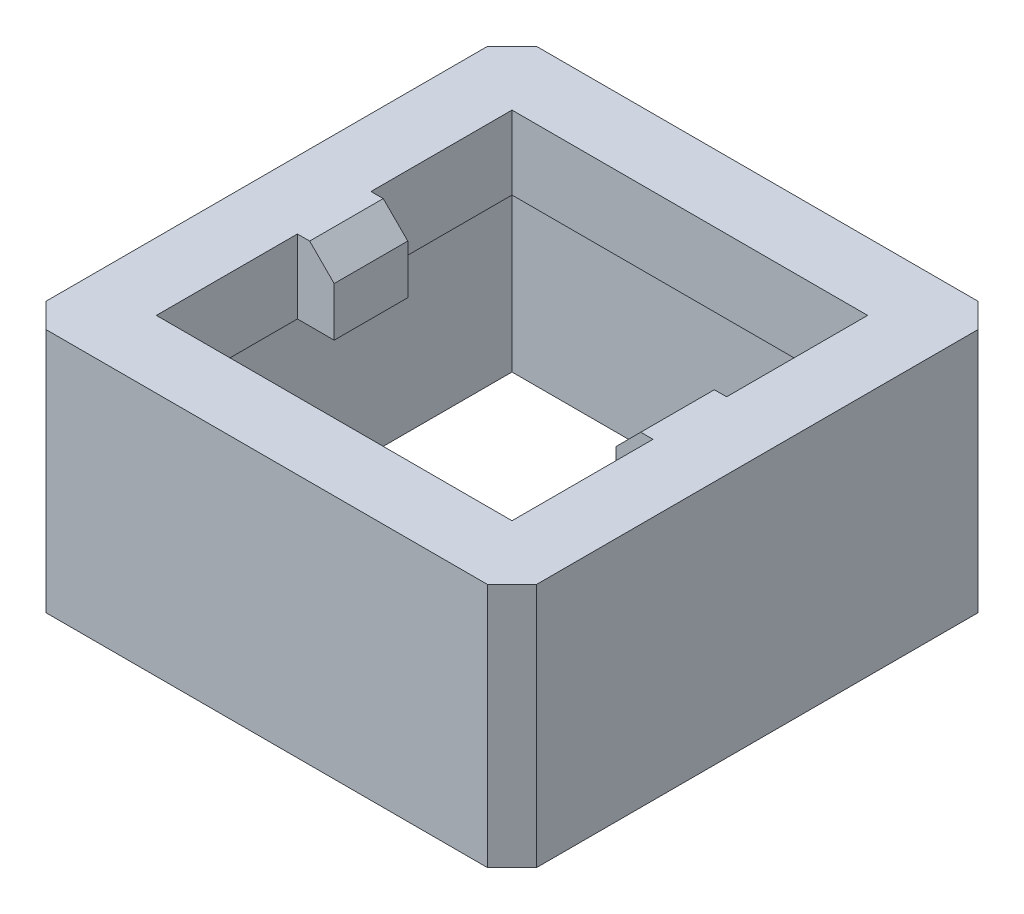
ISO-10303-21;
HEADER;
FILE_DESCRIPTION(('STEP AP214'),'2;1');
FILE_NAME('part.step','',(''),(''),'','','');
FILE_SCHEMA(('AUTOMOTIVE_DESIGN { 1 0 10303 214 1 1 1 1 }'));
ENDSEC;
DATA;
#1=APPLICATION_CONTEXT('core data for automotive mechanical design processes');
#2=APPLICATION_PROTOCOL_DEFINITION('international standard','automotive_design',2000,#1);
#3=PRODUCT_CONTEXT('',#1,'mechanical');
#4=PRODUCT('Part','Part','',(#3));
#5=PRODUCT_RELATED_PRODUCT_CATEGORY('part','',(#4));
#6=PRODUCT_DEFINITION_FORMATION('','',#4);
#7=PRODUCT_DEFINITION_CONTEXT('part definition',#1,'design');
#8=PRODUCT_DEFINITION('design','',#6,#7);
#9=PRODUCT_DEFINITION_SHAPE('','',#8);
#10=(LENGTH_UNIT() NAMED_UNIT(*) SI_UNIT(.MILLI.,.METRE.));
#11=(NAMED_UNIT(*) PLANE_ANGLE_UNIT() SI_UNIT($,.RADIAN.));
#12=(NAMED_UNIT(*) SI_UNIT($,.STERADIAN.) SOLID_ANGLE_UNIT());
#13=UNCERTAINTY_MEASURE_WITH_UNIT(LENGTH_MEASURE(1.E-05),#10,'distance_accuracy_value','');
#14=(GEOMETRIC_REPRESENTATION_CONTEXT(3) GLOBAL_UNCERTAINTY_ASSIGNED_CONTEXT((#13)) GLOBAL_UNIT_ASSIGNED_CONTEXT((#10,
#11,#12)) REPRESENTATION_CONTEXT('',''));
#15=CARTESIAN_POINT('',(0.,0.,0.));
#16=DIRECTION('',(0.,0.,1.));
#17=DIRECTION('',(1.,0.,0.));
#18=AXIS2_PLACEMENT_3D('',#15,#16,#17);
#19=CARTESIAN_POINT('',(-7.25,0.,7.25));
#20=DIRECTION('',(-1.,0.,0.));
#21=DIRECTION('',(0.,0.,1.));
#22=AXIS2_PLACEMENT_3D('',#19,#20,#21);
#23=PLANE('',#22);
#24=DIRECTION('',(0.,0.,1.));
#25=VECTOR('',#24,1.);
#26=CARTESIAN_POINT('',(-7.25,3.,7.25));
#27=LINE('',#26,#25);
#28=CARTESIAN_POINT('',(-7.25,3.,-7.25));
#29=VERTEX_POINT('',#28);
#30=CARTESIAN_POINT('',(-7.25,3.,-1.5));
#31=VERTEX_POINT('',#30);
#32=EDGE_CURVE('E338',#29,#31,#27,.T.);
#33=ORIENTED_EDGE('',*,*,#32,.T.);
#34=DIRECTION('',(0.,1.,0.));
#35=VECTOR('',#34,1.);
#36=CARTESIAN_POINT('',(-7.25,0.,-1.5));
#37=LINE('',#36,#35);
#38=CARTESIAN_POINT('',(-7.25,0.,-1.5));
#39=VERTEX_POINT('',#38);
#40=EDGE_CURVE('E278',#39,#31,#37,.T.);
#41=ORIENTED_EDGE('',*,*,#40,.F.);
#42=DIRECTION('',(0.,0.,1.));
#43=VECTOR('',#42,1.);
#44=CARTESIAN_POINT('',(-7.25,0.,7.25));
#45=LINE('',#44,#43);
#46=CARTESIAN_POINT('',(-7.25,0.,-7.25));
#47=VERTEX_POINT('',#46);
#48=EDGE_CURVE('E324',#47,#39,#45,.T.);
#49=ORIENTED_EDGE('',*,*,#48,.F.);
#50=DIRECTION('',(0.,1.,0.));
#51=VECTOR('',#50,1.);
#52=CARTESIAN_POINT('',(-7.25,0.,-7.25));
#53=LINE('',#52,#51);
#54=EDGE_CURVE('E350',#47,#29,#53,.T.);
#55=ORIENTED_EDGE('',*,*,#54,.T.);
#56=EDGE_LOOP('',(#33,#41,#49,#55));
#57=FACE_BOUND('',#56,.T.);
#58=ADVANCED_FACE('F35',(#57),#23,.F.);
#59=CARTESIAN_POINT('',(7.25,0.,7.25));
#60=DIRECTION('',(1.,0.,0.));
#61=DIRECTION('',(0.,0.,-1.));
#62=AXIS2_PLACEMENT_3D('',#59,#60,#61);
#63=PLANE('',#62);
#64=DIRECTION('',(0.,0.,-1.));
#65=VECTOR('',#64,1.);
#66=CARTESIAN_POINT('',(7.25,3.,7.25));
#67=LINE('',#66,#65);
#68=CARTESIAN_POINT('',(7.25,3.,7.25));
#69=VERTEX_POINT('',#68);
#70=CARTESIAN_POINT('',(7.25,3.,1.5));
#71=VERTEX_POINT('',#70);
#72=EDGE_CURVE('E331',#69,#71,#67,.T.);
#73=ORIENTED_EDGE('',*,*,#72,.T.);
#74=DIRECTION('',(0.,1.,0.));
#75=VECTOR('',#74,1.);
#76=CARTESIAN_POINT('',(7.25,0.,1.5));
#77=LINE('',#76,#75);
#78=CARTESIAN_POINT('',(7.25,0.,1.5));
#79=VERTEX_POINT('',#78);
#80=EDGE_CURVE('E304',#79,#71,#77,.T.);
#81=ORIENTED_EDGE('',*,*,#80,.F.);
#82=DIRECTION('',(0.,0.,-1.));
#83=VECTOR('',#82,1.);
#84=CARTESIAN_POINT('',(7.25,0.,7.25));
#85=LINE('',#84,#83);
#86=CARTESIAN_POINT('',(7.25,0.,7.25));
#87=VERTEX_POINT('',#86);
#88=EDGE_CURVE('E316',#87,#79,#85,.T.);
#89=ORIENTED_EDGE('',*,*,#88,.F.);
#90=DIRECTION('',(0.,1.,0.));
#91=VECTOR('',#90,1.);
#92=CARTESIAN_POINT('',(7.25,0.,7.25));
#93=LINE('',#92,#91);
#94=EDGE_CURVE('E344',#87,#69,#93,.T.);
#95=ORIENTED_EDGE('',*,*,#94,.T.);
#96=EDGE_LOOP('',(#73,#81,#89,#95));
#97=FACE_BOUND('',#96,.T.);
#98=ADVANCED_FACE('F451',(#97),#63,.F.);
#99=CARTESIAN_POINT('',(10.,3.,10.));
#100=DIRECTION('',(-1.,0.,0.));
#101=DIRECTION('',(0.,0.,1.));
#102=AXIS2_PLACEMENT_3D('',#99,#100,#101);
#103=PLANE('',#102);
#104=DIRECTION('',(0.,0.,-1.));
#105=VECTOR('',#104,1.);
#106=CARTESIAN_POINT('',(10.,3.,10.));
#107=LINE('',#106,#105);
#108=CARTESIAN_POINT('',(10.,3.,9.));
#109=VERTEX_POINT('',#108);
#110=CARTESIAN_POINT('',(10.,3.,-8.99999999999999));
#111=VERTEX_POINT('',#110);
#112=EDGE_CURVE('E346',#109,#111,#107,.T.);
#113=ORIENTED_EDGE('',*,*,#112,.F.);
#114=DIRECTION('',(0.,-1.,0.));
#115=VECTOR('',#114,1.);
#116=CARTESIAN_POINT('',(10.,3.,9.));
#117=LINE('',#116,#115);
#118=CARTESIAN_POINT('',(10.,-7.,9.));
#119=VERTEX_POINT('',#118);
#120=EDGE_CURVE('E408',#109,#119,#117,.T.);
#121=ORIENTED_EDGE('',*,*,#120,.T.);
#122=DIRECTION('',(0.,0.,1.));
#123=VECTOR('',#122,1.);
#124=CARTESIAN_POINT('',(10.,-7.,10.));
#125=LINE('',#124,#123);
#126=CARTESIAN_POINT('',(10.,-7.,-8.99999999999999));
#127=VERTEX_POINT('',#126);
#128=EDGE_CURVE('E229',#127,#119,#125,.T.);
#129=ORIENTED_EDGE('',*,*,#128,.F.);
#130=DIRECTION('',(0.,1.,0.));
#131=VECTOR('',#130,1.);
#132=CARTESIAN_POINT('',(10.,3.,-8.99999999999999));
#133=LINE('',#132,#131);
#134=EDGE_CURVE('E406',#127,#111,#133,.T.);
#135=ORIENTED_EDGE('',*,*,#134,.T.);
#136=EDGE_LOOP('',(#113,#121,#129,#135));
#137=FACE_BOUND('',#136,.T.);
#138=ADVANCED_FACE('F414',(#137),#103,.F.);
#139=CARTESIAN_POINT('',(-10.,3.,-10.));
#140=DIRECTION('',(0.,0.,1.));
#141=DIRECTION('',(1.,0.,0.));
#142=AXIS2_PLACEMENT_3D('',#139,#140,#141);
#143=PLANE('',#142);
#144=DIRECTION('',(-1.,0.,0.));
#145=VECTOR('',#144,1.);
#146=CARTESIAN_POINT('',(-10.,3.,-10.));
#147=LINE('',#146,#145);
#148=CARTESIAN_POINT('',(9.,3.,-10.));
#149=VERTEX_POINT('',#148);
#150=CARTESIAN_POINT('',(-9.,3.,-10.));
#151=VERTEX_POINT('',#150);
#152=EDGE_CURVE('E355',#149,#151,#147,.T.);
#153=ORIENTED_EDGE('',*,*,#152,.F.);
#154=DIRECTION('',(0.,-1.,0.));
#155=VECTOR('',#154,1.);
#156=CARTESIAN_POINT('',(9.,3.,-10.));
#157=LINE('',#156,#155);
#158=CARTESIAN_POINT('',(9.,-7.,-10.));
#159=VERTEX_POINT('',#158);
#160=EDGE_CURVE('E11',#149,#159,#157,.T.);
#161=ORIENTED_EDGE('',*,*,#160,.T.);
#162=DIRECTION('',(1.,0.,0.));
#163=VECTOR('',#162,1.);
#164=CARTESIAN_POINT('',(10.,-7.,-10.));
#165=LINE('',#164,#163);
#166=CARTESIAN_POINT('',(-9.,-7.,-10.));
#167=VERTEX_POINT('',#166);
#168=EDGE_CURVE('E260',#167,#159,#165,.T.);
#169=ORIENTED_EDGE('',*,*,#168,.F.);
#170=DIRECTION('',(0.,1.,0.));
#171=VECTOR('',#170,1.);
#172=CARTESIAN_POINT('',(-9.,3.,-10.));
#173=LINE('',#172,#171);
#174=EDGE_CURVE('E43',#167,#151,#173,.T.);
#175=ORIENTED_EDGE('',*,*,#174,.T.);
#176=EDGE_LOOP('',(#153,#161,#169,#175));
#177=FACE_BOUND('',#176,.T.);
#178=ADVANCED_FACE('F423',(#177),#143,.F.);
#179=CARTESIAN_POINT('',(-10.,3.,10.));
#180=DIRECTION('',(1.,0.,0.));
#181=DIRECTION('',(0.,0.,-1.));
#182=AXIS2_PLACEMENT_3D('',#179,#180,#181);
#183=PLANE('',#182);
#184=DIRECTION('',(0.,0.,-1.));
#185=VECTOR('',#184,1.);
#186=CARTESIAN_POINT('',(-10.,-7.,10.));
#187=LINE('',#186,#185);
#188=CARTESIAN_POINT('',(-10.,-7.,9.));
#189=VERTEX_POINT('',#188);
#190=CARTESIAN_POINT('',(-10.,-7.,-9.));
#191=VERTEX_POINT('',#190);
#192=EDGE_CURVE('E257',#189,#191,#187,.T.);
#193=ORIENTED_EDGE('',*,*,#192,.F.);
#194=DIRECTION('',(0.,1.,0.));
#195=VECTOR('',#194,1.);
#196=CARTESIAN_POINT('',(-10.,3.,9.));
#197=LINE('',#196,#195);
#198=CARTESIAN_POINT('',(-10.,3.,9.));
#199=VERTEX_POINT('',#198);
#200=EDGE_CURVE('E397',#189,#199,#197,.T.);
#201=ORIENTED_EDGE('',*,*,#200,.T.);
#202=DIRECTION('',(0.,0.,1.));
#203=VECTOR('',#202,1.);
#204=CARTESIAN_POINT('',(-10.,3.,10.));
#205=LINE('',#204,#203);
#206=CARTESIAN_POINT('',(-10.,3.,-9.));
#207=VERTEX_POINT('',#206);
#208=EDGE_CURVE('E357',#207,#199,#205,.T.);
#209=ORIENTED_EDGE('',*,*,#208,.F.);
#210=DIRECTION('',(0.,-1.,0.));
#211=VECTOR('',#210,1.);
#212=CARTESIAN_POINT('',(-10.,3.,-9.));
#213=LINE('',#212,#211);
#214=EDGE_CURVE('E394',#207,#191,#213,.T.);
#215=ORIENTED_EDGE('',*,*,#214,.T.);
#216=EDGE_LOOP('',(#193,#201,#209,#215));
#217=FACE_BOUND('',#216,.T.);
#218=ADVANCED_FACE('F431',(#217),#183,.F.);
#219=CARTESIAN_POINT('',(-10.,3.,10.));
#220=DIRECTION('',(0.,0.,-1.));
#221=DIRECTION('',(-1.,0.,0.));
#222=AXIS2_PLACEMENT_3D('',#219,#220,#221);
#223=PLANE('',#222);
#224=DIRECTION('',(1.,0.,0.));
#225=VECTOR('',#224,1.);
#226=CARTESIAN_POINT('',(-10.,3.,10.));
#227=LINE('',#226,#225);
#228=CARTESIAN_POINT('',(-9.,3.,10.));
#229=VERTEX_POINT('',#228);
#230=CARTESIAN_POINT('',(8.99999999999999,3.,10.));
#231=VERTEX_POINT('',#230);
#232=EDGE_CURVE('E360',#229,#231,#227,.T.);
#233=ORIENTED_EDGE('',*,*,#232,.F.);
#234=DIRECTION('',(0.,-1.,0.));
#235=VECTOR('',#234,1.);
#236=CARTESIAN_POINT('',(-9.,3.,10.));
#237=LINE('',#236,#235);
#238=CARTESIAN_POINT('',(-9.,-7.,10.));
#239=VERTEX_POINT('',#238);
#240=EDGE_CURVE('E383',#229,#239,#237,.T.);
#241=ORIENTED_EDGE('',*,*,#240,.T.);
#242=DIRECTION('',(-1.,0.,0.));
#243=VECTOR('',#242,1.);
#244=CARTESIAN_POINT('',(10.,-7.,10.));
#245=LINE('',#244,#243);
#246=CARTESIAN_POINT('',(8.99999999999999,-7.,10.));
#247=VERTEX_POINT('',#246);
#248=EDGE_CURVE('E254',#247,#239,#245,.T.);
#249=ORIENTED_EDGE('',*,*,#248,.F.);
#250=DIRECTION('',(0.,1.,0.));
#251=VECTOR('',#250,1.);
#252=CARTESIAN_POINT('',(8.99999999999999,3.,10.));
#253=LINE('',#252,#251);
#254=EDGE_CURVE('E381',#247,#231,#253,.T.);
#255=ORIENTED_EDGE('',*,*,#254,.T.);
#256=EDGE_LOOP('',(#233,#241,#249,#255));
#257=FACE_BOUND('',#256,.T.);
#258=ADVANCED_FACE('F439',(#257),#223,.F.);
#259=CARTESIAN_POINT('',(0.,3.,0.));
#260=DIRECTION('',(0.,-1.,0.));
#261=DIRECTION('',(0.,0.,-1.));
#262=AXIS2_PLACEMENT_3D('',#259,#260,#261);
#263=PLANE('',#262);
#264=DIRECTION('',(1.,0.,0.));
#265=VECTOR('',#264,1.);
#266=CARTESIAN_POINT('',(-7.25,3.,1.5));
#267=LINE('',#266,#265);
#268=CARTESIAN_POINT('',(-7.25,3.,1.5));
#269=VERTEX_POINT('',#268);
#270=CARTESIAN_POINT('',(-6.75,3.,1.5));
#271=VERTEX_POINT('',#270);
#272=EDGE_CURVE('E263',#269,#271,#267,.T.);
#273=ORIENTED_EDGE('',*,*,#272,.T.);
#274=DIRECTION('',(0.,0.,-1.));
#275=VECTOR('',#274,1.);
#276=CARTESIAN_POINT('',(-6.75,3.,-1.5));
#277=LINE('',#276,#275);
#278=CARTESIAN_POINT('',(-6.75,3.,-1.5));
#279=VERTEX_POINT('',#278);
#280=EDGE_CURVE('E366',#271,#279,#277,.T.);
#281=ORIENTED_EDGE('',*,*,#280,.T.);
#282=DIRECTION('',(-1.,0.,0.));
#283=VECTOR('',#282,1.);
#284=CARTESIAN_POINT('',(-7.25,3.,-1.5));
#285=LINE('',#284,#283);
#286=EDGE_CURVE('E268',#279,#31,#285,.T.);
#287=ORIENTED_EDGE('',*,*,#286,.T.);
#288=ORIENTED_EDGE('',*,*,#32,.F.);
#289=DIRECTION('',(-1.,0.,0.));
#290=VECTOR('',#289,1.);
#291=CARTESIAN_POINT('',(-7.25,3.,-7.25));
#292=LINE('',#291,#290);
#293=CARTESIAN_POINT('',(7.25,3.,-7.25));
#294=VERTEX_POINT('',#293);
#295=EDGE_CURVE('E334',#294,#29,#292,.T.);
#296=ORIENTED_EDGE('',*,*,#295,.F.);
#297=CARTESIAN_POINT('',(7.25,3.,-1.5));
#298=VERTEX_POINT('',#297);
#299=EDGE_CURVE('E307',#298,#294,#67,.T.);
#300=ORIENTED_EDGE('',*,*,#299,.F.);
#301=DIRECTION('',(-1.,0.,0.));
#302=VECTOR('',#301,1.);
#303=CARTESIAN_POINT('',(7.25,3.,-1.5));
#304=LINE('',#303,#302);
#305=CARTESIAN_POINT('',(6.75000000000001,3.,-1.5));
#306=VERTEX_POINT('',#305);
#307=EDGE_CURVE('E281',#298,#306,#304,.T.);
#308=ORIENTED_EDGE('',*,*,#307,.T.);
#309=DIRECTION('',(0.,0.,1.));
#310=VECTOR('',#309,1.);
#311=CARTESIAN_POINT('',(6.75000000000001,3.,1.5));
#312=LINE('',#311,#310);
#313=CARTESIAN_POINT('',(6.75000000000001,3.,1.5));
#314=VERTEX_POINT('',#313);
#315=EDGE_CURVE('E363',#306,#314,#312,.T.);
#316=ORIENTED_EDGE('',*,*,#315,.T.);
#317=DIRECTION('',(1.,0.,0.));
#318=VECTOR('',#317,1.);
#319=CARTESIAN_POINT('',(7.25,3.,1.5));
#320=LINE('',#319,#318);
#321=EDGE_CURVE('E294',#314,#71,#320,.T.);
#322=ORIENTED_EDGE('',*,*,#321,.T.);
#323=ORIENTED_EDGE('',*,*,#72,.F.);
#324=DIRECTION('',(1.,0.,0.));
#325=VECTOR('',#324,1.);
#326=CARTESIAN_POINT('',(-7.25,3.,7.25));
#327=LINE('',#326,#325);
#328=CARTESIAN_POINT('',(-7.25,3.,7.25));
#329=VERTEX_POINT('',#328);
#330=EDGE_CURVE('E341',#329,#69,#327,.T.);
#331=ORIENTED_EDGE('',*,*,#330,.F.);
#332=EDGE_CURVE('E337',#269,#329,#27,.T.);
#333=ORIENTED_EDGE('',*,*,#332,.F.);
#334=EDGE_LOOP('',(#273,#281,#287,#288,#296,#300,#308,#316,#322,#323,#331,#333));
#335=FACE_BOUND('',#334,.T.);
#336=ORIENTED_EDGE('',*,*,#208,.T.);
#337=DIRECTION('',(-0.707106781186546,0.,-0.707106781186549));
#338=VECTOR('',#337,1.);
#339=CARTESIAN_POINT('',(-9.,3.,10.));
#340=LINE('',#339,#338);
#341=EDGE_CURVE('E404',#199,#229,#340,.F.);
#342=ORIENTED_EDGE('',*,*,#341,.T.);
#343=ORIENTED_EDGE('',*,*,#232,.T.);
#344=DIRECTION('',(-0.707106781186549,0.,0.707106781186546));
#345=VECTOR('',#344,1.);
#346=CARTESIAN_POINT('',(10.,3.,9.));
#347=LINE('',#346,#345);
#348=EDGE_CURVE('E402',#231,#109,#347,.F.);
#349=ORIENTED_EDGE('',*,*,#348,.T.);
#350=ORIENTED_EDGE('',*,*,#112,.T.);
#351=DIRECTION('',(0.707106781186546,0.,0.707106781186549));
#352=VECTOR('',#351,1.);
#353=CARTESIAN_POINT('',(9.,3.,-10.));
#354=LINE('',#353,#352);
#355=EDGE_CURVE('E56',#111,#149,#354,.F.);
#356=ORIENTED_EDGE('',*,*,#355,.T.);
#357=ORIENTED_EDGE('',*,*,#152,.T.);
#358=DIRECTION('',(0.707106781186549,0.,-0.707106781186546));
#359=VECTOR('',#358,1.);
#360=CARTESIAN_POINT('',(-10.,3.,-9.));
#361=LINE('',#360,#359);
#362=EDGE_CURVE('E399',#151,#207,#361,.F.);
#363=ORIENTED_EDGE('',*,*,#362,.T.);
#364=EDGE_LOOP('',(#336,#342,#343,#349,#350,#356,#357,#363));
#365=FACE_BOUND('',#364,.T.);
#366=ADVANCED_FACE('F425',(#335,#365),#263,.F.);
#367=CARTESIAN_POINT('',(0.,0.,0.));
#368=DIRECTION('',(0.,-1.,0.));
#369=DIRECTION('',(0.,0.,-1.));
#370=AXIS2_PLACEMENT_3D('',#367,#368,#369);
#371=PLANE('',#370);
#372=DIRECTION('',(0.,0.,1.));
#373=VECTOR('',#372,1.);
#374=CARTESIAN_POINT('',(8.,0.,8.));
#375=LINE('',#374,#373);
#376=CARTESIAN_POINT('',(8.,0.,-8.));
#377=VERTEX_POINT('',#376);
#378=CARTESIAN_POINT('',(8.,0.,8.));
#379=VERTEX_POINT('',#378);
#380=EDGE_CURVE('E241',#377,#379,#375,.T.);
#381=ORIENTED_EDGE('',*,*,#380,.T.);
#382=DIRECTION('',(-1.,0.,0.));
#383=VECTOR('',#382,1.);
#384=CARTESIAN_POINT('',(8.,0.,8.));
#385=LINE('',#384,#383);
#386=CARTESIAN_POINT('',(-8.00000000000001,0.,8.));
#387=VERTEX_POINT('',#386);
#388=EDGE_CURVE('E228',#379,#387,#385,.T.);
#389=ORIENTED_EDGE('',*,*,#388,.T.);
#390=DIRECTION('',(0.,0.,-1.));
#391=VECTOR('',#390,1.);
#392=CARTESIAN_POINT('',(-8.,0.,8.));
#393=LINE('',#392,#391);
#394=CARTESIAN_POINT('',(-8.,0.,-8.));
#395=VERTEX_POINT('',#394);
#396=EDGE_CURVE('E244',#387,#395,#393,.T.);
#397=ORIENTED_EDGE('',*,*,#396,.T.);
#398=DIRECTION('',(1.,0.,0.));
#399=VECTOR('',#398,1.);
#400=CARTESIAN_POINT('',(8.,0.,-8.));
#401=LINE('',#400,#399);
#402=EDGE_CURVE('E221',#395,#377,#401,.T.);
#403=ORIENTED_EDGE('',*,*,#402,.T.);
#404=EDGE_LOOP('',(#381,#389,#397,#403));
#405=FACE_BOUND('',#404,.T.);
#406=ORIENTED_EDGE('',*,*,#88,.T.);
#407=DIRECTION('',(1.,0.,0.));
#408=VECTOR('',#407,1.);
#409=CARTESIAN_POINT('',(7.25,0.,1.5));
#410=LINE('',#409,#408);
#411=CARTESIAN_POINT('',(5.75,0.,1.5));
#412=VERTEX_POINT('',#411);
#413=EDGE_CURVE('E297',#412,#79,#410,.T.);
#414=ORIENTED_EDGE('',*,*,#413,.F.);
#415=DIRECTION('',(0.,0.,1.));
#416=VECTOR('',#415,1.);
#417=CARTESIAN_POINT('',(5.75,0.,-1.5));
#418=LINE('',#417,#416);
#419=CARTESIAN_POINT('',(5.75,0.,-1.5));
#420=VERTEX_POINT('',#419);
#421=EDGE_CURVE('E293',#420,#412,#418,.T.);
#422=ORIENTED_EDGE('',*,*,#421,.F.);
#423=DIRECTION('',(-1.,0.,0.));
#424=VECTOR('',#423,1.);
#425=CARTESIAN_POINT('',(7.25,0.,-1.5));
#426=LINE('',#425,#424);
#427=CARTESIAN_POINT('',(7.25,0.,-1.5));
#428=VERTEX_POINT('',#427);
#429=EDGE_CURVE('E290',#428,#420,#426,.T.);
#430=ORIENTED_EDGE('',*,*,#429,.F.);
#431=CARTESIAN_POINT('',(7.25,0.,-7.25));
#432=VERTEX_POINT('',#431);
#433=EDGE_CURVE('E320',#428,#432,#85,.T.);
#434=ORIENTED_EDGE('',*,*,#433,.T.);
#435=DIRECTION('',(-1.,0.,0.));
#436=VECTOR('',#435,1.);
#437=CARTESIAN_POINT('',(-7.25,0.,-7.25));
#438=LINE('',#437,#436);
#439=EDGE_CURVE('E319',#432,#47,#438,.T.);
#440=ORIENTED_EDGE('',*,*,#439,.T.);
#441=ORIENTED_EDGE('',*,*,#48,.T.);
#442=DIRECTION('',(-1.,0.,0.));
#443=VECTOR('',#442,1.);
#444=CARTESIAN_POINT('',(-7.25,0.,-1.5));
#445=LINE('',#444,#443);
#446=CARTESIAN_POINT('',(-5.75,0.,-1.5));
#447=VERTEX_POINT('',#446);
#448=EDGE_CURVE('E271',#447,#39,#445,.T.);
#449=ORIENTED_EDGE('',*,*,#448,.F.);
#450=DIRECTION('',(0.,0.,-1.));
#451=VECTOR('',#450,1.);
#452=CARTESIAN_POINT('',(-5.75,0.,-1.5));
#453=LINE('',#452,#451);
#454=CARTESIAN_POINT('',(-5.75,0.,1.5));
#455=VERTEX_POINT('',#454);
#456=EDGE_CURVE('E267',#455,#447,#453,.T.);
#457=ORIENTED_EDGE('',*,*,#456,.F.);
#458=DIRECTION('',(1.,0.,0.));
#459=VECTOR('',#458,1.);
#460=CARTESIAN_POINT('',(-7.25,0.,1.5));
#461=LINE('',#460,#459);
#462=CARTESIAN_POINT('',(-7.25,0.,1.5));
#463=VERTEX_POINT('',#462);
#464=EDGE_CURVE('E264',#463,#455,#461,.T.);
#465=ORIENTED_EDGE('',*,*,#464,.F.);
#466=CARTESIAN_POINT('',(-7.25,0.,7.25));
#467=VERTEX_POINT('',#466);
#468=EDGE_CURVE('E323',#463,#467,#45,.T.);
#469=ORIENTED_EDGE('',*,*,#468,.T.);
#470=DIRECTION('',(1.,0.,0.));
#471=VECTOR('',#470,1.);
#472=CARTESIAN_POINT('',(-7.25,0.,7.25));
#473=LINE('',#472,#471);
#474=EDGE_CURVE('E327',#467,#87,#473,.T.);
#475=ORIENTED_EDGE('',*,*,#474,.T.);
#476=EDGE_LOOP('',(#406,#414,#422,#430,#434,#440,#441,#449,#457,#465,#469,#475));
#477=FACE_BOUND('',#476,.T.);
#478=ADVANCED_FACE('F483',(#405,#477),#371,.T.);
#479=ORIENTED_EDGE('',*,*,#433,.F.);
#480=DIRECTION('',(0.,1.,0.));
#481=VECTOR('',#480,1.);
#482=CARTESIAN_POINT('',(7.25,0.,-1.5));
#483=LINE('',#482,#481);
#484=EDGE_CURVE('E300',#428,#298,#483,.T.);
#485=ORIENTED_EDGE('',*,*,#484,.T.);
#486=ORIENTED_EDGE('',*,*,#299,.T.);
#487=DIRECTION('',(0.,1.,0.));
#488=VECTOR('',#487,1.);
#489=CARTESIAN_POINT('',(7.25,0.,-7.25));
#490=LINE('',#489,#488);
#491=EDGE_CURVE('E330',#432,#294,#490,.T.);
#492=ORIENTED_EDGE('',*,*,#491,.F.);
#493=EDGE_LOOP('',(#479,#485,#486,#492));
#494=FACE_BOUND('',#493,.T.);
#495=ADVANCED_FACE('F460',(#494),#63,.F.);
#496=CARTESIAN_POINT('',(-7.25,0.,7.25));
#497=DIRECTION('',(0.,0.,1.));
#498=DIRECTION('',(1.,0.,0.));
#499=AXIS2_PLACEMENT_3D('',#496,#497,#498);
#500=PLANE('',#499);
#501=ORIENTED_EDGE('',*,*,#330,.T.);
#502=ORIENTED_EDGE('',*,*,#94,.F.);
#503=ORIENTED_EDGE('',*,*,#474,.F.);
#504=DIRECTION('',(0.,1.,0.));
#505=VECTOR('',#504,1.);
#506=CARTESIAN_POINT('',(-7.25,0.,7.25));
#507=LINE('',#506,#505);
#508=EDGE_CURVE('E347',#467,#329,#507,.T.);
#509=ORIENTED_EDGE('',*,*,#508,.T.);
#510=EDGE_LOOP('',(#501,#502,#503,#509));
#511=FACE_BOUND('',#510,.T.);
#512=ADVANCED_FACE('F465',(#511),#500,.F.);
#513=ORIENTED_EDGE('',*,*,#468,.F.);
#514=DIRECTION('',(0.,1.,0.));
#515=VECTOR('',#514,1.);
#516=CARTESIAN_POINT('',(-7.25,0.,1.5));
#517=LINE('',#516,#515);
#518=EDGE_CURVE('E274',#463,#269,#517,.T.);
#519=ORIENTED_EDGE('',*,*,#518,.T.);
#520=ORIENTED_EDGE('',*,*,#332,.T.);
#521=ORIENTED_EDGE('',*,*,#508,.F.);
#522=EDGE_LOOP('',(#513,#519,#520,#521));
#523=FACE_BOUND('',#522,.T.);
#524=ADVANCED_FACE('F454',(#523),#23,.F.);
#525=CARTESIAN_POINT('',(-7.25,0.,-7.25));
#526=DIRECTION('',(0.,0.,-1.));
#527=DIRECTION('',(-1.,0.,0.));
#528=AXIS2_PLACEMENT_3D('',#525,#526,#527);
#529=PLANE('',#528);
#530=ORIENTED_EDGE('',*,*,#295,.T.);
#531=ORIENTED_EDGE('',*,*,#54,.F.);
#532=ORIENTED_EDGE('',*,*,#439,.F.);
#533=ORIENTED_EDGE('',*,*,#491,.T.);
#534=EDGE_LOOP('',(#530,#531,#532,#533));
#535=FACE_BOUND('',#534,.T.);
#536=ADVANCED_FACE('F464',(#535),#529,.F.);
#537=CARTESIAN_POINT('',(7.25,0.,1.5));
#538=DIRECTION('',(0.,0.,1.));
#539=DIRECTION('',(1.,0.,0.));
#540=AXIS2_PLACEMENT_3D('',#537,#538,#539);
#541=PLANE('',#540);
#542=ORIENTED_EDGE('',*,*,#321,.F.);
#543=DIRECTION('',(-0.707106781186546,-0.707106781186549,0.));
#544=VECTOR('',#543,1.);
#545=CARTESIAN_POINT('',(5.5,1.74999999999999,1.5));
#546=LINE('',#545,#544);
#547=CARTESIAN_POINT('',(5.75,2.,1.5));
#548=VERTEX_POINT('',#547);
#549=EDGE_CURVE('E375',#314,#548,#546,.T.);
#550=ORIENTED_EDGE('',*,*,#549,.T.);
#551=DIRECTION('',(0.,1.,0.));
#552=VECTOR('',#551,1.);
#553=CARTESIAN_POINT('',(5.75,0.,1.5));
#554=LINE('',#553,#552);
#555=EDGE_CURVE('E308',#412,#548,#554,.T.);
#556=ORIENTED_EDGE('',*,*,#555,.F.);
#557=ORIENTED_EDGE('',*,*,#413,.T.);
#558=ORIENTED_EDGE('',*,*,#80,.T.);
#559=EDGE_LOOP('',(#542,#550,#556,#557,#558));
#560=FACE_BOUND('',#559,.T.);
#561=ADVANCED_FACE('F471',(#560),#541,.T.);
#562=CARTESIAN_POINT('',(5.75,0.,-1.5));
#563=DIRECTION('',(-1.,0.,0.));
#564=DIRECTION('',(0.,0.,1.));
#565=AXIS2_PLACEMENT_3D('',#562,#563,#564);
#566=PLANE('',#565);
#567=ORIENTED_EDGE('',*,*,#555,.T.);
#568=DIRECTION('',(0.,0.,-1.));
#569=VECTOR('',#568,1.);
#570=CARTESIAN_POINT('',(5.75,2.,-1.5));
#571=LINE('',#570,#569);
#572=CARTESIAN_POINT('',(5.75,2.,-1.5));
#573=VERTEX_POINT('',#572);
#574=EDGE_CURVE('E377',#548,#573,#571,.T.);
#575=ORIENTED_EDGE('',*,*,#574,.T.);
#576=DIRECTION('',(0.,1.,0.));
#577=VECTOR('',#576,1.);
#578=CARTESIAN_POINT('',(5.75,0.,-1.5));
#579=LINE('',#578,#577);
#580=EDGE_CURVE('E311',#420,#573,#579,.T.);
#581=ORIENTED_EDGE('',*,*,#580,.F.);
#582=ORIENTED_EDGE('',*,*,#421,.T.);
#583=EDGE_LOOP('',(#567,#575,#581,#582));
#584=FACE_BOUND('',#583,.T.);
#585=ADVANCED_FACE('F520',(#584),#566,.T.);
#586=CARTESIAN_POINT('',(7.25,0.,-1.5));
#587=DIRECTION('',(0.,0.,-1.));
#588=DIRECTION('',(-1.,0.,0.));
#589=AXIS2_PLACEMENT_3D('',#586,#587,#588);
#590=PLANE('',#589);
#591=ORIENTED_EDGE('',*,*,#580,.T.);
#592=DIRECTION('',(0.707106781186546,0.707106781186549,0.));
#593=VECTOR('',#592,1.);
#594=CARTESIAN_POINT('',(5.5,1.74999999999999,-1.5));
#595=LINE('',#594,#593);
#596=EDGE_CURVE('E379',#573,#306,#595,.T.);
#597=ORIENTED_EDGE('',*,*,#596,.T.);
#598=ORIENTED_EDGE('',*,*,#307,.F.);
#599=ORIENTED_EDGE('',*,*,#484,.F.);
#600=ORIENTED_EDGE('',*,*,#429,.T.);
#601=EDGE_LOOP('',(#591,#597,#598,#599,#600));
#602=FACE_BOUND('',#601,.T.);
#603=ADVANCED_FACE('F507',(#602),#590,.T.);
#604=CARTESIAN_POINT('',(-7.25,0.,-1.5));
#605=DIRECTION('',(0.,0.,-1.));
#606=DIRECTION('',(-1.,0.,0.));
#607=AXIS2_PLACEMENT_3D('',#604,#605,#606);
#608=PLANE('',#607);
#609=ORIENTED_EDGE('',*,*,#286,.F.);
#610=DIRECTION('',(0.707106781186546,-0.707106781186549,0.));
#611=VECTOR('',#610,1.);
#612=CARTESIAN_POINT('',(-5.5,1.74999999999999,-1.5));
#613=LINE('',#612,#611);
#614=CARTESIAN_POINT('',(-5.75,2.,-1.5));
#615=VERTEX_POINT('',#614);
#616=EDGE_CURVE('E369',#279,#615,#613,.T.);
#617=ORIENTED_EDGE('',*,*,#616,.T.);
#618=DIRECTION('',(0.,1.,0.));
#619=VECTOR('',#618,1.);
#620=CARTESIAN_POINT('',(-5.75,0.,-1.5));
#621=LINE('',#620,#619);
#622=EDGE_CURVE('E282',#447,#615,#621,.T.);
#623=ORIENTED_EDGE('',*,*,#622,.F.);
#624=ORIENTED_EDGE('',*,*,#448,.T.);
#625=ORIENTED_EDGE('',*,*,#40,.T.);
#626=EDGE_LOOP('',(#609,#617,#623,#624,#625));
#627=FACE_BOUND('',#626,.T.);
#628=ADVANCED_FACE('F496',(#627),#608,.T.);
#629=CARTESIAN_POINT('',(-5.75,0.,-1.5));
#630=DIRECTION('',(1.,0.,0.));
#631=DIRECTION('',(0.,0.,-1.));
#632=AXIS2_PLACEMENT_3D('',#629,#630,#631);
#633=PLANE('',#632);
#634=ORIENTED_EDGE('',*,*,#622,.T.);
#635=DIRECTION('',(0.,0.,1.));
#636=VECTOR('',#635,1.);
#637=CARTESIAN_POINT('',(-5.75,2.,1.5));
#638=LINE('',#637,#636);
#639=CARTESIAN_POINT('',(-5.75,2.,1.5));
#640=VERTEX_POINT('',#639);
#641=EDGE_CURVE('E371',#615,#640,#638,.T.);
#642=ORIENTED_EDGE('',*,*,#641,.T.);
#643=DIRECTION('',(0.,1.,0.));
#644=VECTOR('',#643,1.);
#645=CARTESIAN_POINT('',(-5.75,0.,1.5));
#646=LINE('',#645,#644);
#647=EDGE_CURVE('E285',#455,#640,#646,.T.);
#648=ORIENTED_EDGE('',*,*,#647,.F.);
#649=ORIENTED_EDGE('',*,*,#456,.T.);
#650=EDGE_LOOP('',(#634,#642,#648,#649));
#651=FACE_BOUND('',#650,.T.);
#652=ADVANCED_FACE('F486',(#651),#633,.T.);
#653=CARTESIAN_POINT('',(-7.25,0.,1.5));
#654=DIRECTION('',(0.,0.,1.));
#655=DIRECTION('',(1.,0.,0.));
#656=AXIS2_PLACEMENT_3D('',#653,#654,#655);
#657=PLANE('',#656);
#658=ORIENTED_EDGE('',*,*,#647,.T.);
#659=DIRECTION('',(-0.707106781186546,0.707106781186549,0.));
#660=VECTOR('',#659,1.);
#661=CARTESIAN_POINT('',(-5.5,1.74999999999999,1.5));
#662=LINE('',#661,#660);
#663=EDGE_CURVE('E373',#640,#271,#662,.T.);
#664=ORIENTED_EDGE('',*,*,#663,.T.);
#665=ORIENTED_EDGE('',*,*,#272,.F.);
#666=ORIENTED_EDGE('',*,*,#518,.F.);
#667=ORIENTED_EDGE('',*,*,#464,.T.);
#668=EDGE_LOOP('',(#658,#664,#665,#666,#667));
#669=FACE_BOUND('',#668,.T.);
#670=ADVANCED_FACE('F481',(#669),#657,.T.);
#671=CARTESIAN_POINT('',(-6.75,3.,0.));
#672=DIRECTION('',(0.707106781186549,0.707106781186546,0.));
#673=DIRECTION('',(0.,0.,1.));
#674=AXIS2_PLACEMENT_3D('',#671,#672,#673);
#675=PLANE('',#674);
#676=ORIENTED_EDGE('',*,*,#663,.F.);
#677=ORIENTED_EDGE('',*,*,#641,.F.);
#678=ORIENTED_EDGE('',*,*,#616,.F.);
#679=ORIENTED_EDGE('',*,*,#280,.F.);
#680=EDGE_LOOP('',(#676,#677,#678,#679));
#681=FACE_BOUND('',#680,.T.);
#682=ADVANCED_FACE('F491',(#681),#675,.T.);
#683=CARTESIAN_POINT('',(6.75000000000001,3.,0.));
#684=DIRECTION('',(-0.707106781186549,0.707106781186546,0.));
#685=DIRECTION('',(0.,0.,-1.));
#686=AXIS2_PLACEMENT_3D('',#683,#684,#685);
#687=PLANE('',#686);
#688=ORIENTED_EDGE('',*,*,#596,.F.);
#689=ORIENTED_EDGE('',*,*,#574,.F.);
#690=ORIENTED_EDGE('',*,*,#549,.F.);
#691=ORIENTED_EDGE('',*,*,#315,.F.);
#692=EDGE_LOOP('',(#688,#689,#690,#691));
#693=FACE_BOUND('',#692,.T.);
#694=ADVANCED_FACE('F511',(#693),#687,.T.);
#695=CARTESIAN_POINT('',(0.,-7.,0.));
#696=DIRECTION('',(0.,1.,0.));
#697=DIRECTION('',(0.,0.,1.));
#698=AXIS2_PLACEMENT_3D('',#695,#696,#697);
#699=PLANE('',#698);
#700=ORIENTED_EDGE('',*,*,#248,.T.);
#701=DIRECTION('',(0.707106781186546,0.,0.707106781186549));
#702=VECTOR('',#701,1.);
#703=CARTESIAN_POINT('',(-9.,-7.,10.));
#704=LINE('',#703,#702);
#705=EDGE_CURVE('E392',#239,#189,#704,.F.);
#706=ORIENTED_EDGE('',*,*,#705,.T.);
#707=ORIENTED_EDGE('',*,*,#192,.T.);
#708=DIRECTION('',(-0.707106781186549,0.,0.707106781186546));
#709=VECTOR('',#708,1.);
#710=CARTESIAN_POINT('',(-10.,-7.,-9.));
#711=LINE('',#710,#709);
#712=EDGE_CURVE('E386',#191,#167,#711,.F.);
#713=ORIENTED_EDGE('',*,*,#712,.T.);
#714=ORIENTED_EDGE('',*,*,#168,.T.);
#715=DIRECTION('',(-0.707106781186546,0.,-0.707106781186549));
#716=VECTOR('',#715,1.);
#717=CARTESIAN_POINT('',(9.,-7.,-10.));
#718=LINE('',#717,#716);
#719=EDGE_CURVE('E388',#159,#127,#718,.F.);
#720=ORIENTED_EDGE('',*,*,#719,.T.);
#721=ORIENTED_EDGE('',*,*,#128,.T.);
#722=DIRECTION('',(0.707106781186549,0.,-0.707106781186546));
#723=VECTOR('',#722,1.);
#724=CARTESIAN_POINT('',(10.,-7.,9.));
#725=LINE('',#724,#723);
#726=EDGE_CURVE('E390',#119,#247,#725,.F.);
#727=ORIENTED_EDGE('',*,*,#726,.T.);
#728=EDGE_LOOP('',(#700,#706,#707,#713,#714,#720,#721,#727));
#729=FACE_BOUND('',#728,.T.);
#730=DIRECTION('',(0.,0.,1.));
#731=VECTOR('',#730,1.);
#732=CARTESIAN_POINT('',(8.,-7.,8.));
#733=LINE('',#732,#731);
#734=CARTESIAN_POINT('',(8.,-7.,-8.));
#735=VERTEX_POINT('',#734);
#736=CARTESIAN_POINT('',(8.,-7.,8.));
#737=VERTEX_POINT('',#736);
#738=EDGE_CURVE('E210',#735,#737,#733,.T.);
#739=ORIENTED_EDGE('',*,*,#738,.F.);
#740=DIRECTION('',(1.,0.,0.));
#741=VECTOR('',#740,1.);
#742=CARTESIAN_POINT('',(8.,-7.,-8.));
#743=LINE('',#742,#741);
#744=CARTESIAN_POINT('',(-8.,-7.,-8.));
#745=VERTEX_POINT('',#744);
#746=EDGE_CURVE('E237',#745,#735,#743,.T.);
#747=ORIENTED_EDGE('',*,*,#746,.F.);
#748=DIRECTION('',(0.,0.,-1.));
#749=VECTOR('',#748,1.);
#750=CARTESIAN_POINT('',(-8.,-7.,8.));
#751=LINE('',#750,#749);
#752=CARTESIAN_POINT('',(-8.,-7.,8.));
#753=VERTEX_POINT('',#752);
#754=EDGE_CURVE('E235',#753,#745,#751,.T.);
#755=ORIENTED_EDGE('',*,*,#754,.F.);
#756=DIRECTION('',(-1.,0.,0.));
#757=VECTOR('',#756,1.);
#758=CARTESIAN_POINT('',(8.,-7.,8.));
#759=LINE('',#758,#757);
#760=EDGE_CURVE('E220',#737,#753,#759,.T.);
#761=ORIENTED_EDGE('',*,*,#760,.F.);
#762=EDGE_LOOP('',(#739,#747,#755,#761));
#763=FACE_BOUND('',#762,.T.);
#764=ADVANCED_FACE('F233',(#729,#763),#699,.F.);
#765=CARTESIAN_POINT('',(8.,-7.,8.));
#766=DIRECTION('',(-1.,0.,0.));
#767=DIRECTION('',(0.,0.,1.));
#768=AXIS2_PLACEMENT_3D('',#765,#766,#767);
#769=PLANE('',#768);
#770=ORIENTED_EDGE('',*,*,#380,.F.);
#771=DIRECTION('',(0.,1.,0.));
#772=VECTOR('',#771,1.);
#773=CARTESIAN_POINT('',(8.,-7.,-8.));
#774=LINE('',#773,#772);
#775=EDGE_CURVE('E216',#735,#377,#774,.T.);
#776=ORIENTED_EDGE('',*,*,#775,.F.);
#777=ORIENTED_EDGE('',*,*,#738,.T.);
#778=DIRECTION('',(0.,1.,0.));
#779=VECTOR('',#778,1.);
#780=CARTESIAN_POINT('',(8.,-7.,8.));
#781=LINE('',#780,#779);
#782=EDGE_CURVE('E214',#737,#379,#781,.T.);
#783=ORIENTED_EDGE('',*,*,#782,.T.);
#784=EDGE_LOOP('',(#770,#776,#777,#783));
#785=FACE_BOUND('',#784,.T.);
#786=ADVANCED_FACE('F213',(#785),#769,.T.);
#787=CARTESIAN_POINT('',(8.,-7.,8.));
#788=DIRECTION('',(0.,0.,-1.));
#789=DIRECTION('',(-1.,0.,0.));
#790=AXIS2_PLACEMENT_3D('',#787,#788,#789);
#791=PLANE('',#790);
#792=ORIENTED_EDGE('',*,*,#388,.F.);
#793=ORIENTED_EDGE('',*,*,#782,.F.);
#794=ORIENTED_EDGE('',*,*,#760,.T.);
#795=DIRECTION('',(0.,1.,0.));
#796=VECTOR('',#795,1.);
#797=CARTESIAN_POINT('',(-8.,-7.,8.));
#798=LINE('',#797,#796);
#799=EDGE_CURVE('E230',#753,#387,#798,.T.);
#800=ORIENTED_EDGE('',*,*,#799,.T.);
#801=EDGE_LOOP('',(#792,#793,#794,#800));
#802=FACE_BOUND('',#801,.T.);
#803=ADVANCED_FACE('F225',(#802),#791,.T.);
#804=CARTESIAN_POINT('',(-8.,-7.,8.));
#805=DIRECTION('',(1.,0.,0.));
#806=DIRECTION('',(0.,0.,-1.));
#807=AXIS2_PLACEMENT_3D('',#804,#805,#806);
#808=PLANE('',#807);
#809=ORIENTED_EDGE('',*,*,#396,.F.);
#810=ORIENTED_EDGE('',*,*,#799,.F.);
#811=ORIENTED_EDGE('',*,*,#754,.T.);
#812=DIRECTION('',(0.,1.,0.));
#813=VECTOR('',#812,1.);
#814=CARTESIAN_POINT('',(-8.,-7.,-8.));
#815=LINE('',#814,#813);
#816=EDGE_CURVE('E248',#745,#395,#815,.T.);
#817=ORIENTED_EDGE('',*,*,#816,.T.);
#818=EDGE_LOOP('',(#809,#810,#811,#817));
#819=FACE_BOUND('',#818,.T.);
#820=ADVANCED_FACE('F542',(#819),#808,.T.);
#821=CARTESIAN_POINT('',(8.,-7.,-8.));
#822=DIRECTION('',(0.,0.,1.));
#823=DIRECTION('',(1.,0.,0.));
#824=AXIS2_PLACEMENT_3D('',#821,#822,#823);
#825=PLANE('',#824);
#826=ORIENTED_EDGE('',*,*,#402,.F.);
#827=ORIENTED_EDGE('',*,*,#816,.F.);
#828=ORIENTED_EDGE('',*,*,#746,.T.);
#829=ORIENTED_EDGE('',*,*,#775,.T.);
#830=EDGE_LOOP('',(#826,#827,#828,#829));
#831=FACE_BOUND('',#830,.T.);
#832=ADVANCED_FACE('F448',(#831),#825,.T.);
#833=CARTESIAN_POINT('',(-9.,3.,10.));
#834=DIRECTION('',(0.707106781186549,0.,-0.707106781186546));
#835=DIRECTION('',(0.,-1.,0.));
#836=AXIS2_PLACEMENT_3D('',#833,#834,#835);
#837=PLANE('',#836);
#838=ORIENTED_EDGE('',*,*,#341,.F.);
#839=ORIENTED_EDGE('',*,*,#200,.F.);
#840=ORIENTED_EDGE('',*,*,#705,.F.);
#841=ORIENTED_EDGE('',*,*,#240,.F.);
#842=EDGE_LOOP('',(#838,#839,#840,#841));
#843=FACE_BOUND('',#842,.T.);
#844=ADVANCED_FACE('F436',(#843),#837,.F.);
#845=CARTESIAN_POINT('',(10.,3.,9.));
#846=DIRECTION('',(-0.707106781186546,0.,-0.707106781186549));
#847=DIRECTION('',(0.,-1.,0.));
#848=AXIS2_PLACEMENT_3D('',#845,#846,#847);
#849=PLANE('',#848);
#850=ORIENTED_EDGE('',*,*,#348,.F.);
#851=ORIENTED_EDGE('',*,*,#254,.F.);
#852=ORIENTED_EDGE('',*,*,#726,.F.);
#853=ORIENTED_EDGE('',*,*,#120,.F.);
#854=EDGE_LOOP('',(#850,#851,#852,#853));
#855=FACE_BOUND('',#854,.T.);
#856=ADVANCED_FACE('F441',(#855),#849,.F.);
#857=CARTESIAN_POINT('',(9.,3.,-10.));
#858=DIRECTION('',(-0.707106781186549,0.,0.707106781186546));
#859=DIRECTION('',(0.,-1.,0.));
#860=AXIS2_PLACEMENT_3D('',#857,#858,#859);
#861=PLANE('',#860);
#862=ORIENTED_EDGE('',*,*,#355,.F.);
#863=ORIENTED_EDGE('',*,*,#134,.F.);
#864=ORIENTED_EDGE('',*,*,#719,.F.);
#865=ORIENTED_EDGE('',*,*,#160,.F.);
#866=EDGE_LOOP('',(#862,#863,#864,#865));
#867=FACE_BOUND('',#866,.T.);
#868=ADVANCED_FACE('F422',(#867),#861,.F.);
#869=CARTESIAN_POINT('',(-10.,3.,-9.));
#870=DIRECTION('',(0.707106781186546,0.,0.707106781186549));
#871=DIRECTION('',(0.,-1.,0.));
#872=AXIS2_PLACEMENT_3D('',#869,#870,#871);
#873=PLANE('',#872);
#874=ORIENTED_EDGE('',*,*,#362,.F.);
#875=ORIENTED_EDGE('',*,*,#174,.F.);
#876=ORIENTED_EDGE('',*,*,#712,.F.);
#877=ORIENTED_EDGE('',*,*,#214,.F.);
#878=EDGE_LOOP('',(#874,#875,#876,#877));
#879=FACE_BOUND('',#878,.T.);
#880=ADVANCED_FACE('F37',(#879),#873,.F.);
#881=CLOSED_SHELL('',(#58,#98,#138,#178,#218,#258,#366,#478,#495,#512,#524,#536,#561,#585,#603,
#628,#652,#670,#682,#694,#764,#786,#803,#820,#832,#844,#856,#868,#880));
#882=MANIFOLD_SOLID_BREP('B2',#881);
#883=ADVANCED_BREP_SHAPE_REPRESENTATION('',(#18,#882),#14);
#884=SHAPE_DEFINITION_REPRESENTATION(#9,#883);
ENDSEC;
END-ISO-10303-21;
